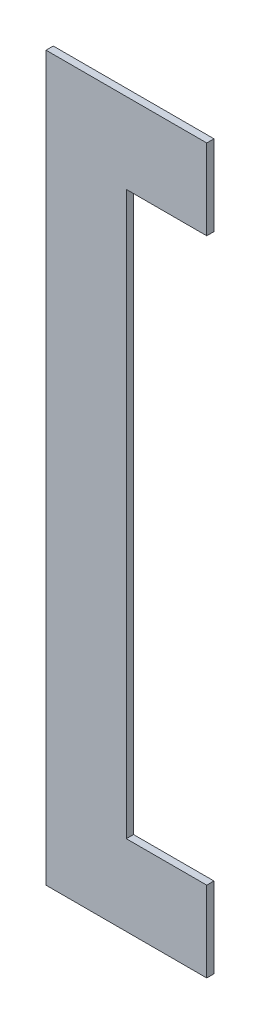
ISO-10303-21;
HEADER;
FILE_DESCRIPTION(('STEP AP214'),'2;1');
FILE_NAME('part.step','',(''),(''),'','','');
FILE_SCHEMA(('AUTOMOTIVE_DESIGN { 1 0 10303 214 1 1 1 1 }'));
ENDSEC;
DATA;
#1=APPLICATION_CONTEXT('core data for automotive mechanical design processes');
#2=APPLICATION_PROTOCOL_DEFINITION('international standard','automotive_design',2000,#1);
#3=PRODUCT_CONTEXT('',#1,'mechanical');
#4=PRODUCT('Part','Part','',(#3));
#5=PRODUCT_RELATED_PRODUCT_CATEGORY('part','',(#4));
#6=PRODUCT_DEFINITION_FORMATION('','',#4);
#7=PRODUCT_DEFINITION_CONTEXT('part definition',#1,'design');
#8=PRODUCT_DEFINITION('design','',#6,#7);
#9=PRODUCT_DEFINITION_SHAPE('','',#8);
#10=(LENGTH_UNIT() NAMED_UNIT(*) SI_UNIT(.MILLI.,.METRE.));
#11=(NAMED_UNIT(*) PLANE_ANGLE_UNIT() SI_UNIT($,.RADIAN.));
#12=(NAMED_UNIT(*) SI_UNIT($,.STERADIAN.) SOLID_ANGLE_UNIT());
#13=UNCERTAINTY_MEASURE_WITH_UNIT(LENGTH_MEASURE(1.E-05),#10,'distance_accuracy_value','');
#14=(GEOMETRIC_REPRESENTATION_CONTEXT(3) GLOBAL_UNCERTAINTY_ASSIGNED_CONTEXT((#13)) GLOBAL_UNIT_ASSIGNED_CONTEXT((#10,
#11,#12)) REPRESENTATION_CONTEXT('',''));
#15=CARTESIAN_POINT('',(0.,0.,0.));
#16=DIRECTION('',(0.,0.,1.));
#17=DIRECTION('',(1.,0.,0.));
#18=AXIS2_PLACEMENT_3D('',#15,#16,#17);
#19=CARTESIAN_POINT('',(0.,0.,0.05));
#20=DIRECTION('',(0.,0.,1.));
#21=DIRECTION('',(1.,0.,0.));
#22=AXIS2_PLACEMENT_3D('',#19,#20,#21);
#23=PLANE('',#22);
#24=DIRECTION('',(0.,1.,0.));
#25=VECTOR('',#24,1.);
#26=CARTESIAN_POINT('',(1.389,2.5,0.05));
#27=LINE('',#26,#25);
#28=CARTESIAN_POINT('',(1.389,-2.5,0.05));
#29=VERTEX_POINT('',#28);
#30=CARTESIAN_POINT('',(1.389,2.5,0.05));
#31=VERTEX_POINT('',#30);
#32=EDGE_CURVE('E94',#29,#31,#27,.T.);
#33=ORIENTED_EDGE('',*,*,#32,.F.);
#34=DIRECTION('',(1.,0.,0.));
#35=VECTOR('',#34,1.);
#36=CARTESIAN_POINT('',(1.389,-2.5,0.05));
#37=LINE('',#36,#35);
#38=CARTESIAN_POINT('',(2.5,-2.5,0.05));
#39=VERTEX_POINT('',#38);
#40=EDGE_CURVE('E20',#39,#29,#37,.F.);
#41=ORIENTED_EDGE('',*,*,#40,.F.);
#42=DIRECTION('',(0.,1.,0.));
#43=VECTOR('',#42,1.);
#44=CARTESIAN_POINT('',(2.5,-2.5,0.05));
#45=LINE('',#44,#43);
#46=CARTESIAN_POINT('',(2.5,-1.944,0.05));
#47=VERTEX_POINT('',#46);
#48=EDGE_CURVE('E83',#47,#39,#45,.F.);
#49=ORIENTED_EDGE('',*,*,#48,.F.);
#50=DIRECTION('',(1.,0.,0.));
#51=VECTOR('',#50,1.);
#52=CARTESIAN_POINT('',(2.5,-1.944,0.05));
#53=LINE('',#52,#51);
#54=CARTESIAN_POINT('',(1.944,-1.944,0.05));
#55=VERTEX_POINT('',#54);
#56=EDGE_CURVE('E78',#55,#47,#53,.T.);
#57=ORIENTED_EDGE('',*,*,#56,.F.);
#58=DIRECTION('',(0.,1.,0.));
#59=VECTOR('',#58,1.);
#60=CARTESIAN_POINT('',(1.944,-1.944,0.05));
#61=LINE('',#60,#59);
#62=CARTESIAN_POINT('',(1.944,1.944,0.05));
#63=VERTEX_POINT('',#62);
#64=EDGE_CURVE('E105',#63,#55,#61,.F.);
#65=ORIENTED_EDGE('',*,*,#64,.F.);
#66=DIRECTION('',(1.,0.,0.));
#67=VECTOR('',#66,1.);
#68=CARTESIAN_POINT('',(1.944,1.944,0.05));
#69=LINE('',#68,#67);
#70=CARTESIAN_POINT('',(2.5,1.944,0.05));
#71=VERTEX_POINT('',#70);
#72=EDGE_CURVE('E109',#71,#63,#69,.F.);
#73=ORIENTED_EDGE('',*,*,#72,.F.);
#74=DIRECTION('',(0.,1.,0.));
#75=VECTOR('',#74,1.);
#76=CARTESIAN_POINT('',(2.5,1.944,0.05));
#77=LINE('',#76,#75);
#78=CARTESIAN_POINT('',(2.5,2.5,0.05));
#79=VERTEX_POINT('',#78);
#80=EDGE_CURVE('E113',#79,#71,#77,.F.);
#81=ORIENTED_EDGE('',*,*,#80,.F.);
#82=DIRECTION('',(1.,0.,0.));
#83=VECTOR('',#82,1.);
#84=CARTESIAN_POINT('',(2.5,2.5,0.05));
#85=LINE('',#84,#83);
#86=EDGE_CURVE('E117',#31,#79,#85,.T.);
#87=ORIENTED_EDGE('',*,*,#86,.F.);
#88=EDGE_LOOP('',(#33,#41,#49,#57,#65,#73,#81,#87));
#89=FACE_BOUND('',#88,.T.);
#90=ADVANCED_FACE('F17',(#89),#23,.T.);
#91=CARTESIAN_POINT('',(1.389,-2.5,0.));
#92=DIRECTION('',(0.,-1.,0.));
#93=DIRECTION('',(0.,0.,-1.));
#94=AXIS2_PLACEMENT_3D('',#91,#92,#93);
#95=PLANE('',#94);
#96=DIRECTION('',(0.,0.,1.));
#97=VECTOR('',#96,1.);
#98=CARTESIAN_POINT('',(1.389,-2.5,0.));
#99=LINE('',#98,#97);
#100=CARTESIAN_POINT('',(1.389,-2.5,0.));
#101=VERTEX_POINT('',#100);
#102=EDGE_CURVE('E121',#101,#29,#99,.T.);
#103=ORIENTED_EDGE('',*,*,#102,.F.);
#104=DIRECTION('',(1.,0.,0.));
#105=VECTOR('',#104,1.);
#106=CARTESIAN_POINT('',(0.,-2.5,0.));
#107=LINE('',#106,#105);
#108=CARTESIAN_POINT('',(2.5,-2.5,0.));
#109=VERTEX_POINT('',#108);
#110=EDGE_CURVE('E100',#101,#109,#107,.T.);
#111=ORIENTED_EDGE('',*,*,#110,.T.);
#112=DIRECTION('',(0.,0.,-1.));
#113=VECTOR('',#112,1.);
#114=CARTESIAN_POINT('',(2.5,-2.5,0.));
#115=LINE('',#114,#113);
#116=EDGE_CURVE('E88',#39,#109,#115,.T.);
#117=ORIENTED_EDGE('',*,*,#116,.F.);
#118=ORIENTED_EDGE('',*,*,#40,.T.);
#119=EDGE_LOOP('',(#103,#111,#117,#118));
#120=FACE_BOUND('',#119,.T.);
#121=ADVANCED_FACE('F99',(#120),#95,.T.);
#122=CARTESIAN_POINT('',(2.5,-2.5,0.));
#123=DIRECTION('',(1.,0.,0.));
#124=DIRECTION('',(0.,0.,-1.));
#125=AXIS2_PLACEMENT_3D('',#122,#123,#124);
#126=PLANE('',#125);
#127=ORIENTED_EDGE('',*,*,#116,.T.);
#128=DIRECTION('',(0.,1.,0.));
#129=VECTOR('',#128,1.);
#130=CARTESIAN_POINT('',(2.5,0.,0.));
#131=LINE('',#130,#129);
#132=CARTESIAN_POINT('',(2.5,-1.944,0.));
#133=VERTEX_POINT('',#132);
#134=EDGE_CURVE('E126',#109,#133,#131,.T.);
#135=ORIENTED_EDGE('',*,*,#134,.T.);
#136=DIRECTION('',(0.,0.,1.));
#137=VECTOR('',#136,1.);
#138=CARTESIAN_POINT('',(2.5,-1.944,0.));
#139=LINE('',#138,#137);
#140=EDGE_CURVE('E90',#47,#133,#139,.F.);
#141=ORIENTED_EDGE('',*,*,#140,.F.);
#142=ORIENTED_EDGE('',*,*,#48,.T.);
#143=EDGE_LOOP('',(#127,#135,#141,#142));
#144=FACE_BOUND('',#143,.T.);
#145=ADVANCED_FACE('F85',(#144),#126,.T.);
#146=CARTESIAN_POINT('',(2.5,-1.944,0.));
#147=DIRECTION('',(0.,1.,0.));
#148=DIRECTION('',(0.,0.,1.));
#149=AXIS2_PLACEMENT_3D('',#146,#147,#148);
#150=PLANE('',#149);
#151=ORIENTED_EDGE('',*,*,#140,.T.);
#152=DIRECTION('',(1.,0.,0.));
#153=VECTOR('',#152,1.);
#154=CARTESIAN_POINT('',(0.,-1.944,0.));
#155=LINE('',#154,#153);
#156=CARTESIAN_POINT('',(1.944,-1.944,0.));
#157=VERTEX_POINT('',#156);
#158=EDGE_CURVE('E128',#133,#157,#155,.F.);
#159=ORIENTED_EDGE('',*,*,#158,.T.);
#160=DIRECTION('',(0.,0.,-1.));
#161=VECTOR('',#160,1.);
#162=CARTESIAN_POINT('',(1.944,-1.944,0.));
#163=LINE('',#162,#161);
#164=EDGE_CURVE('E107',#55,#157,#163,.T.);
#165=ORIENTED_EDGE('',*,*,#164,.F.);
#166=ORIENTED_EDGE('',*,*,#56,.T.);
#167=EDGE_LOOP('',(#151,#159,#165,#166));
#168=FACE_BOUND('',#167,.T.);
#169=ADVANCED_FACE('F162',(#168),#150,.T.);
#170=CARTESIAN_POINT('',(1.944,-1.944,0.));
#171=DIRECTION('',(1.,0.,0.));
#172=DIRECTION('',(0.,0.,-1.));
#173=AXIS2_PLACEMENT_3D('',#170,#171,#172);
#174=PLANE('',#173);
#175=ORIENTED_EDGE('',*,*,#164,.T.);
#176=DIRECTION('',(0.,1.,0.));
#177=VECTOR('',#176,1.);
#178=CARTESIAN_POINT('',(1.944,0.,0.));
#179=LINE('',#178,#177);
#180=CARTESIAN_POINT('',(1.944,1.944,0.));
#181=VERTEX_POINT('',#180);
#182=EDGE_CURVE('E131',#157,#181,#179,.T.);
#183=ORIENTED_EDGE('',*,*,#182,.T.);
#184=DIRECTION('',(0.,0.,-1.));
#185=VECTOR('',#184,1.);
#186=CARTESIAN_POINT('',(1.944,1.944,0.));
#187=LINE('',#186,#185);
#188=EDGE_CURVE('E111',#63,#181,#187,.T.);
#189=ORIENTED_EDGE('',*,*,#188,.F.);
#190=ORIENTED_EDGE('',*,*,#64,.T.);
#191=EDGE_LOOP('',(#175,#183,#189,#190));
#192=FACE_BOUND('',#191,.T.);
#193=ADVANCED_FACE('F161',(#192),#174,.T.);
#194=CARTESIAN_POINT('',(1.944,1.944,0.));
#195=DIRECTION('',(0.,-1.,0.));
#196=DIRECTION('',(0.,0.,-1.));
#197=AXIS2_PLACEMENT_3D('',#194,#195,#196);
#198=PLANE('',#197);
#199=ORIENTED_EDGE('',*,*,#188,.T.);
#200=DIRECTION('',(1.,0.,0.));
#201=VECTOR('',#200,1.);
#202=CARTESIAN_POINT('',(0.,1.944,0.));
#203=LINE('',#202,#201);
#204=CARTESIAN_POINT('',(2.5,1.944,0.));
#205=VERTEX_POINT('',#204);
#206=EDGE_CURVE('E134',#181,#205,#203,.T.);
#207=ORIENTED_EDGE('',*,*,#206,.T.);
#208=DIRECTION('',(0.,0.,-1.));
#209=VECTOR('',#208,1.);
#210=CARTESIAN_POINT('',(2.5,1.944,0.));
#211=LINE('',#210,#209);
#212=EDGE_CURVE('E115',#71,#205,#211,.T.);
#213=ORIENTED_EDGE('',*,*,#212,.F.);
#214=ORIENTED_EDGE('',*,*,#72,.T.);
#215=EDGE_LOOP('',(#199,#207,#213,#214));
#216=FACE_BOUND('',#215,.T.);
#217=ADVANCED_FACE('F155',(#216),#198,.T.);
#218=CARTESIAN_POINT('',(2.5,1.944,0.));
#219=DIRECTION('',(1.,0.,0.));
#220=DIRECTION('',(0.,0.,-1.));
#221=AXIS2_PLACEMENT_3D('',#218,#219,#220);
#222=PLANE('',#221);
#223=ORIENTED_EDGE('',*,*,#212,.T.);
#224=DIRECTION('',(0.,1.,0.));
#225=VECTOR('',#224,1.);
#226=CARTESIAN_POINT('',(2.5,0.,0.));
#227=LINE('',#226,#225);
#228=CARTESIAN_POINT('',(2.5,2.5,0.));
#229=VERTEX_POINT('',#228);
#230=EDGE_CURVE('E137',#205,#229,#227,.T.);
#231=ORIENTED_EDGE('',*,*,#230,.T.);
#232=DIRECTION('',(0.,0.,1.));
#233=VECTOR('',#232,1.);
#234=CARTESIAN_POINT('',(2.5,2.5,0.));
#235=LINE('',#234,#233);
#236=EDGE_CURVE('E119',#79,#229,#235,.F.);
#237=ORIENTED_EDGE('',*,*,#236,.F.);
#238=ORIENTED_EDGE('',*,*,#80,.T.);
#239=EDGE_LOOP('',(#223,#231,#237,#238));
#240=FACE_BOUND('',#239,.T.);
#241=ADVANCED_FACE('F150',(#240),#222,.T.);
#242=CARTESIAN_POINT('',(2.5,2.5,0.));
#243=DIRECTION('',(0.,1.,0.));
#244=DIRECTION('',(0.,0.,1.));
#245=AXIS2_PLACEMENT_3D('',#242,#243,#244);
#246=PLANE('',#245);
#247=ORIENTED_EDGE('',*,*,#236,.T.);
#248=DIRECTION('',(1.,0.,0.));
#249=VECTOR('',#248,1.);
#250=CARTESIAN_POINT('',(0.,2.5,0.));
#251=LINE('',#250,#249);
#252=CARTESIAN_POINT('',(1.389,2.5,0.));
#253=VERTEX_POINT('',#252);
#254=EDGE_CURVE('E26',#229,#253,#251,.F.);
#255=ORIENTED_EDGE('',*,*,#254,.T.);
#256=DIRECTION('',(0.,0.,1.));
#257=VECTOR('',#256,1.);
#258=CARTESIAN_POINT('',(1.389,2.5,0.));
#259=LINE('',#258,#257);
#260=EDGE_CURVE('E34',#31,#253,#259,.F.);
#261=ORIENTED_EDGE('',*,*,#260,.F.);
#262=ORIENTED_EDGE('',*,*,#86,.T.);
#263=EDGE_LOOP('',(#247,#255,#261,#262));
#264=FACE_BOUND('',#263,.T.);
#265=ADVANCED_FACE('F143',(#264),#246,.T.);
#266=CARTESIAN_POINT('',(1.389,2.5,0.));
#267=DIRECTION('',(-1.,0.,0.));
#268=DIRECTION('',(0.,0.,1.));
#269=AXIS2_PLACEMENT_3D('',#266,#267,#268);
#270=PLANE('',#269);
#271=ORIENTED_EDGE('',*,*,#260,.T.);
#272=DIRECTION('',(0.,1.,0.));
#273=VECTOR('',#272,1.);
#274=CARTESIAN_POINT('',(1.389,0.,0.));
#275=LINE('',#274,#273);
#276=EDGE_CURVE('E11',#253,#101,#275,.F.);
#277=ORIENTED_EDGE('',*,*,#276,.T.);
#278=ORIENTED_EDGE('',*,*,#102,.T.);
#279=ORIENTED_EDGE('',*,*,#32,.T.);
#280=EDGE_LOOP('',(#271,#277,#278,#279));
#281=FACE_BOUND('',#280,.T.);
#282=ADVANCED_FACE('F163',(#281),#270,.T.);
#283=CARTESIAN_POINT('',(0.,0.,0.));
#284=DIRECTION('',(0.,0.,1.));
#285=DIRECTION('',(1.,0.,0.));
#286=AXIS2_PLACEMENT_3D('',#283,#284,#285);
#287=PLANE('',#286);
#288=ORIENTED_EDGE('',*,*,#254,.F.);
#289=ORIENTED_EDGE('',*,*,#230,.F.);
#290=ORIENTED_EDGE('',*,*,#206,.F.);
#291=ORIENTED_EDGE('',*,*,#182,.F.);
#292=ORIENTED_EDGE('',*,*,#158,.F.);
#293=ORIENTED_EDGE('',*,*,#134,.F.);
#294=ORIENTED_EDGE('',*,*,#110,.F.);
#295=ORIENTED_EDGE('',*,*,#276,.F.);
#296=EDGE_LOOP('',(#288,#289,#290,#291,#292,#293,#294,#295));
#297=FACE_BOUND('',#296,.T.);
#298=ADVANCED_FACE('F147',(#297),#287,.F.);
#299=CLOSED_SHELL('',(#90,#121,#145,#169,#193,#217,#241,#265,#282,#298));
#300=MANIFOLD_SOLID_BREP('B1',#299);
#301=ADVANCED_BREP_SHAPE_REPRESENTATION('',(#18,#300),#14);
#302=SHAPE_DEFINITION_REPRESENTATION(#9,#301);
ENDSEC;
END-ISO-10303-21;
